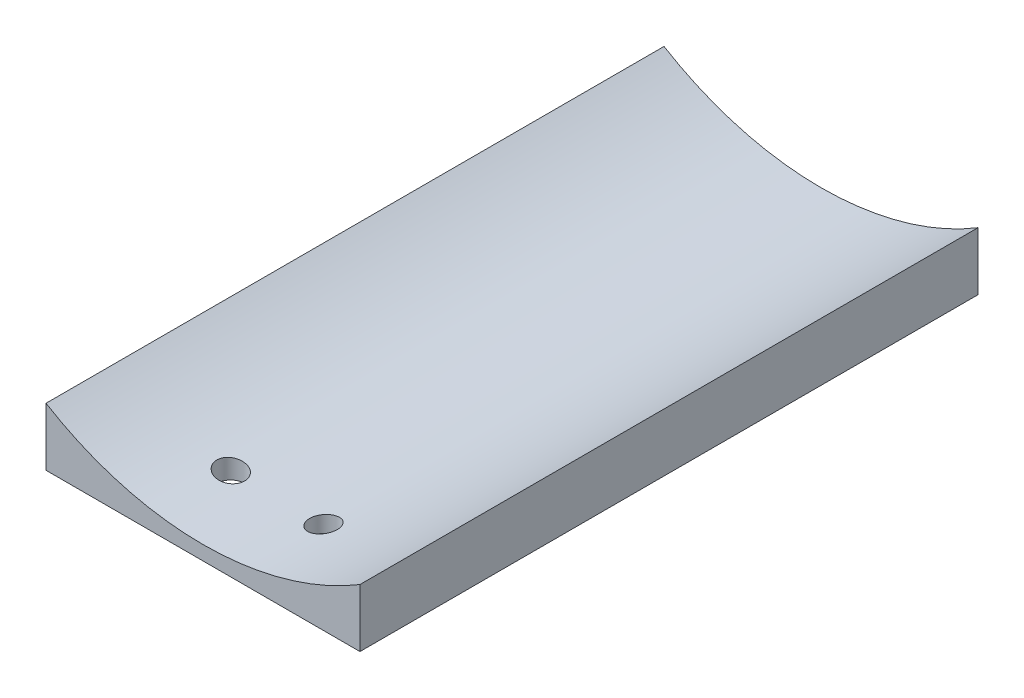
ISO-10303-21;
HEADER;
FILE_DESCRIPTION(('STEP AP214'),'2;1');
FILE_NAME('part.step','',(''),(''),'','','');
FILE_SCHEMA(('AUTOMOTIVE_DESIGN { 1 0 10303 214 1 1 1 1 }'));
ENDSEC;
DATA;
#1=APPLICATION_CONTEXT('core data for automotive mechanical design processes');
#2=APPLICATION_PROTOCOL_DEFINITION('international standard','automotive_design',2000,#1);
#3=PRODUCT_CONTEXT('',#1,'mechanical');
#4=PRODUCT('Part','Part','',(#3));
#5=PRODUCT_RELATED_PRODUCT_CATEGORY('part','',(#4));
#6=PRODUCT_DEFINITION_FORMATION('','',#4);
#7=PRODUCT_DEFINITION_CONTEXT('part definition',#1,'design');
#8=PRODUCT_DEFINITION('design','',#6,#7);
#9=PRODUCT_DEFINITION_SHAPE('','',#8);
#10=(LENGTH_UNIT() NAMED_UNIT(*) SI_UNIT(.MILLI.,.METRE.));
#11=(NAMED_UNIT(*) PLANE_ANGLE_UNIT() SI_UNIT($,.RADIAN.));
#12=(NAMED_UNIT(*) SI_UNIT($,.STERADIAN.) SOLID_ANGLE_UNIT());
#13=UNCERTAINTY_MEASURE_WITH_UNIT(LENGTH_MEASURE(1.E-05),#10,'distance_accuracy_value','');
#14=(GEOMETRIC_REPRESENTATION_CONTEXT(3) GLOBAL_UNCERTAINTY_ASSIGNED_CONTEXT((#13)) GLOBAL_UNIT_ASSIGNED_CONTEXT((#10,
#11,#12)) REPRESENTATION_CONTEXT('',''));
#15=CARTESIAN_POINT('',(0.,0.,0.));
#16=DIRECTION('',(0.,0.,1.));
#17=DIRECTION('',(1.,0.,0.));
#18=AXIS2_PLACEMENT_3D('',#15,#16,#17);
#19=CARTESIAN_POINT('',(0.,0.,-20.));
#20=DIRECTION('',(0.,0.,-1.));
#21=DIRECTION('',(-1.,0.,0.));
#22=AXIS2_PLACEMENT_3D('',#19,#20,#21);
#23=PLANE('',#22);
#24=DIRECTION('',(0.,-1.,0.));
#25=VECTOR('',#24,1.);
#26=CARTESIAN_POINT('',(25.4,30.,-20.));
#27=LINE('',#26,#25);
#28=CARTESIAN_POINT('',(25.4,22.0972554598151,-20.));
#29=VERTEX_POINT('',#28);
#30=CARTESIAN_POINT('',(25.4,12.7,-20.));
#31=VERTEX_POINT('',#30);
#32=EDGE_CURVE('E58',#29,#31,#27,.T.);
#33=ORIENTED_EDGE('',*,*,#32,.T.);
#34=DIRECTION('',(-1.,0.,0.));
#35=VECTOR('',#34,1.);
#36=CARTESIAN_POINT('',(63.51,12.7,-20.));
#37=LINE('',#36,#35);
#38=CARTESIAN_POINT('',(-25.4,12.7,-20.));
#39=VERTEX_POINT('',#38);
#40=EDGE_CURVE('E102',#31,#39,#37,.T.);
#41=ORIENTED_EDGE('',*,*,#40,.T.);
#42=DIRECTION('',(0.,1.,0.));
#43=VECTOR('',#42,1.);
#44=CARTESIAN_POINT('',(-25.4,30.,-20.));
#45=LINE('',#44,#43);
#46=CARTESIAN_POINT('',(-25.4,22.097255459815,-20.));
#47=VERTEX_POINT('',#46);
#48=EDGE_CURVE('E90',#39,#47,#45,.T.);
#49=ORIENTED_EDGE('',*,*,#48,.T.);
#50=CARTESIAN_POINT('',(0.,64.,-20.));
#51=DIRECTION('',(0.,0.,1.));
#52=DIRECTION('',(1.,0.,0.));
#53=AXIS2_PLACEMENT_3D('',#50,#51,#52);
#54=CIRCLE('',#53,49.);
#55=EDGE_CURVE('E235',#47,#29,#54,.T.);
#56=ORIENTED_EDGE('',*,*,#55,.T.);
#57=EDGE_LOOP('',(#33,#41,#49,#56));
#58=FACE_BOUND('',#57,.T.);
#59=ADVANCED_FACE('F47',(#58),#23,.T.);
#60=CARTESIAN_POINT('',(25.4,30.,80.));
#61=DIRECTION('',(-1.,0.,0.));
#62=DIRECTION('',(0.,0.,1.));
#63=AXIS2_PLACEMENT_3D('',#60,#61,#62);
#64=PLANE('',#63);
#65=DIRECTION('',(0.,0.,-1.));
#66=VECTOR('',#65,1.);
#67=CARTESIAN_POINT('',(25.4,12.7,80.));
#68=LINE('',#67,#66);
#69=CARTESIAN_POINT('',(25.4,12.7,80.));
#70=VERTEX_POINT('',#69);
#71=EDGE_CURVE('E11',#70,#31,#68,.T.);
#72=ORIENTED_EDGE('',*,*,#71,.T.);
#73=ORIENTED_EDGE('',*,*,#32,.F.);
#74=DIRECTION('',(0.,0.,1.));
#75=VECTOR('',#74,1.);
#76=CARTESIAN_POINT('',(25.4,22.0972554598151,-20.));
#77=LINE('',#76,#75);
#78=CARTESIAN_POINT('',(25.4,22.0972554598151,80.));
#79=VERTEX_POINT('',#78);
#80=EDGE_CURVE('E238',#29,#79,#77,.T.);
#81=ORIENTED_EDGE('',*,*,#80,.T.);
#82=DIRECTION('',(0.,-1.,0.));
#83=VECTOR('',#82,1.);
#84=CARTESIAN_POINT('',(25.4,30.,80.));
#85=LINE('',#84,#83);
#86=EDGE_CURVE('E248',#79,#70,#85,.T.);
#87=ORIENTED_EDGE('',*,*,#86,.T.);
#88=EDGE_LOOP('',(#72,#73,#81,#87));
#89=FACE_BOUND('',#88,.T.);
#90=ADVANCED_FACE('F150',(#89),#64,.F.);
#91=CARTESIAN_POINT('',(7.50000000000002,0.,68.));
#92=DIRECTION('',(0.,-1.,0.));
#93=DIRECTION('',(0.,0.,-1.));
#94=AXIS2_PLACEMENT_3D('',#91,#92,#93);
#95=CYLINDRICAL_SURFACE('',#94,2.25);
#96=CARTESIAN_POINT('',(7.50000000000002,15.577381318231,65.75));
#97=CARTESIAN_POINT('',(7.628012111726,15.597209390993,65.7500055593505));
#98=CARTESIAN_POINT('',(7.75603908473121,15.6175636610785,65.7609597123096));
#99=CARTESIAN_POINT('',(8.00842021394335,15.658696630682,65.8044487558249));
#100=CARTESIAN_POINT('',(8.13276950128072,15.6794758361999,65.8370110249154));
#101=CARTESIAN_POINT('',(8.37413092049167,15.7207196170612,65.922794270927));
#102=CARTESIAN_POINT('',(8.49114637916096,15.741184331838,65.9760058009177));
#103=CARTESIAN_POINT('',(8.71453836839212,15.7810233408164,66.1016282301116));
#104=CARTESIAN_POINT('',(8.82091771802788,15.8003979233565,66.1740340232468));
#105=CARTESIAN_POINT('',(9.01979673057494,15.837218814644,66.3359313789961));
#106=CARTESIAN_POINT('',(9.11232383039285,15.8546689166162,66.425388347351));
#107=CARTESIAN_POINT('',(9.28098907001027,15.8868974758926,66.6190359794301));
#108=CARTESIAN_POINT('',(9.35712764943423,15.9016760048603,66.723226247807));
#109=CARTESIAN_POINT('',(9.48972709811994,15.9276628427844,66.9418836795673));
#110=CARTESIAN_POINT('',(9.54644342071123,15.9389173186091,67.0561903752019));
#111=CARTESIAN_POINT('',(9.63982834212078,15.9575604989746,67.2930132324826));
#112=CARTESIAN_POINT('',(9.67649931209462,15.9649496607373,67.4155284212245));
#113=CARTESIAN_POINT('',(9.7281284215421,15.9753791836516,67.662918690262));
#114=CARTESIAN_POINT('',(9.74346580510113,15.9784954880935,67.7877114997753));
#115=CARTESIAN_POINT('',(9.75316313629945,15.9804640137949,68.0381386688777));
#116=CARTESIAN_POINT('',(9.74752463753941,15.9793165508549,68.163772965453));
#117=CARTESIAN_POINT('',(9.71561622413508,15.9728508448629,68.4110097229757));
#118=CARTESIAN_POINT('',(9.68955098112392,15.9675739783086,68.5326397758451));
#119=CARTESIAN_POINT('',(9.61786017104885,15.9531677261214,68.7697461754686));
#120=CARTESIAN_POINT('',(9.57223427998517,15.944038276675,68.8852224202563));
#121=CARTESIAN_POINT('',(9.46251582810181,15.9223136689365,69.1074622062525));
#122=CARTESIAN_POINT('',(9.39832470210526,15.9097000291337,69.2141752342499));
#123=CARTESIAN_POINT('',(9.25347524205779,15.8816186637555,69.4153412932485));
#124=CARTESIAN_POINT('',(9.17281556657491,15.8661507056938,69.5097933245148));
#125=CARTESIAN_POINT('',(8.99586260050361,15.8327634478072,69.685434807945));
#126=CARTESIAN_POINT('',(8.89933278514944,15.8148078327427,69.7663790437941));
#127=CARTESIAN_POINT('',(8.69434177346173,15.7773988332725,69.910964057507));
#128=CARTESIAN_POINT('',(8.58587947258229,15.7579453102612,69.9746032316094));
#129=CARTESIAN_POINT('',(8.35814909327495,15.7179649562042,70.0838148152157));
#130=CARTESIAN_POINT('',(8.23873354146886,15.6974257893936,70.129075394263));
#131=CARTESIAN_POINT('',(7.99397826064038,15.656316820316,70.1987903168134));
#132=CARTESIAN_POINT('',(7.86863824902037,15.635747016633,70.2232436667491));
#133=CARTESIAN_POINT('',(7.61466705728205,15.5951088441296,70.2507273538284));
#134=CARTESIAN_POINT('',(7.48601938102004,15.5750447930966,70.2536120862373));
#135=CARTESIAN_POINT('',(7.22992336115789,15.5361476530431,70.2374135732674));
#136=CARTESIAN_POINT('',(7.10247500072671,15.5173145467255,70.2183306366448));
#137=CARTESIAN_POINT('',(6.85298091147682,15.4814212838101,70.1587606268426));
#138=CARTESIAN_POINT('',(6.73091520091365,15.464354184596,70.118361499629));
#139=CARTESIAN_POINT('',(6.49521299776712,15.4322497219861,70.0172616496348));
#140=CARTESIAN_POINT('',(6.3815760926147,15.4172122592149,69.9565619213205));
#141=CARTESIAN_POINT('',(6.16714661576844,15.389528925854,69.8171949756079));
#142=CARTESIAN_POINT('',(6.06624209776508,15.3768616566205,69.7387042512458));
#143=CARTESIAN_POINT('',(5.87902434815,15.3538697661579,69.5656266816005));
#144=CARTESIAN_POINT('',(5.79271041414665,15.3435450321507,69.4710406115885));
#145=CARTESIAN_POINT('',(5.63795713164395,15.3253713430171,69.2693730619903));
#146=CARTESIAN_POINT('',(5.56936532475836,15.31750114161,69.1624104672917));
#147=CARTESIAN_POINT('',(5.45109244562694,15.3041156794153,68.9383616866586));
#148=CARTESIAN_POINT('',(5.40141074136657,15.2986003399225,68.8212758392246));
#149=CARTESIAN_POINT('',(5.32265902359327,15.2899304811374,68.5810155431723));
#150=CARTESIAN_POINT('',(5.29347476161626,15.2867628705351,68.4578790031678));
#151=CARTESIAN_POINT('',(5.25612713728423,15.2827188110226,68.2084217860801));
#152=CARTESIAN_POINT('',(5.24796345558871,15.281842327306,68.0821011573983));
#153=CARTESIAN_POINT('',(5.25289138597353,15.2823734473757,67.8301894624403));
#154=CARTESIAN_POINT('',(5.26593125585982,15.2837754909565,67.7045973684802));
#155=CARTESIAN_POINT('',(5.31278508766321,15.2888630516745,67.4573985569649));
#156=CARTESIAN_POINT('',(5.34659897571597,15.2925485606925,67.3357918252409));
#157=CARTESIAN_POINT('',(5.43401077895919,15.3022233798455,67.1000004015597));
#158=CARTESIAN_POINT('',(5.48760993009529,15.3082128339045,66.9858161737956));
#159=CARTESIAN_POINT('',(5.61301877253993,15.3225104796827,66.7680975666634));
#160=CARTESIAN_POINT('',(5.68482783751499,15.3308185916522,66.6645628211764));
#161=CARTESIAN_POINT('',(5.84475564904883,15.3497655419543,66.4707889771997));
#162=CARTESIAN_POINT('',(5.93291351702032,15.3604099823963,66.3805827232072));
#163=CARTESIAN_POINT('',(6.12288475566154,15.3839591883326,66.216231094813));
#164=CARTESIAN_POINT('',(6.22470173961046,15.3968645521918,66.142089983781));
#165=CARTESIAN_POINT('',(6.43968893859219,15.4248806317548,66.0114922317072));
#166=CARTESIAN_POINT('',(6.55292516873467,15.4400044311161,65.9551472348386));
#167=CARTESIAN_POINT('',(6.78689554019515,15.4721529541833,65.862293169079));
#168=CARTESIAN_POINT('',(6.90762110202076,15.4891755199517,65.8257618534679));
#169=CARTESIAN_POINT('',(7.10756543193489,15.5181617757285,65.7830776954983));
#170=CARTESIAN_POINT('',(7.18557568595643,15.529660763128,65.7706832778541));
#171=CARTESIAN_POINT('',(7.34238874823167,15.5531671289364,65.7541427116057));
#172=CARTESIAN_POINT('',(7.42119155787652,15.5651745082378,65.749996577482));
#173=CARTESIAN_POINT('',(7.50000000000002,15.577381318231,65.75));
#174=B_SPLINE_CURVE_WITH_KNOTS('',3,(#96,#97,#98,#99,#100,#101,#102,#103,#104,#105,#106,#107,
#108,#109,#110,#111,#112,#113,#114,#115,#116,#117,#118,#119,#120,#121,#122,#123,#124,#125,#126,
#127,#128,#129,#130,#131,#132,#133,#134,#135,#136,#137,#138,#139,#140,#141,#142,#143,#144,#145,
#146,#147,#148,#149,#150,#151,#152,#153,#154,#155,#156,#157,#158,#159,#160,#161,#162,#163,#164,
#165,#166,#167,#168,#169,#170,#171,#172,#173),.UNSPECIFIED.,.T.,.F.,(4,2,2,2,2,2,2,2,2,2,2,2,2,
2,2,2,2,2,2,2,2,2,2,2,2,2,2,2,2,2,2,2,2,2,2,2,2,2,4),(0.,0.388324372965482,0.777141713668451,
1.16578138175374,1.55431776727635,1.94207410390068,2.32982003760791,2.71225034395115,
3.09463540299366,3.47013200805642,3.84560080212388,4.21735484470044,4.58911504519548,
4.9628863830861,5.33668817836394,5.7166729715635,6.09669296818747,6.48291547687903,
6.869156427071,7.25800246607199,7.64684303989891,8.03409174397395,8.42132148066329,
8.80486597891188,9.18839200804262,9.56849969033591,9.9485946675327,10.3265538913895,
10.7045073733304,11.0815399335824,11.4585711532609,11.8356259293092,12.2126677382448,
12.5906237015288,12.9686798443019,13.3490626684547,13.729017511505,13.9680822744682,
14.2071474571245),.UNSPECIFIED.);
#175=CARTESIAN_POINT('',(7.50000000000002,15.577381318231,65.75));
#176=VERTEX_POINT('',#175);
#177=EDGE_CURVE('E131',#176,#176,#174,.T.);
#178=ORIENTED_EDGE('',*,*,#177,.F.);
#179=EDGE_LOOP('',(#178));
#180=FACE_BOUND('',#179,.T.);
#181=CARTESIAN_POINT('',(7.50000000000002,12.7000000000001,68.));
#182=DIRECTION('',(0.,-1.,0.));
#183=DIRECTION('',(0.,0.,-1.));
#184=AXIS2_PLACEMENT_3D('',#181,#182,#183);
#185=CIRCLE('',#184,2.25);
#186=CARTESIAN_POINT('',(7.50000000000002,12.7000000000001,65.75));
#187=VERTEX_POINT('',#186);
#188=EDGE_CURVE('E113',#187,#187,#185,.F.);
#189=ORIENTED_EDGE('',*,*,#188,.F.);
#190=EDGE_LOOP('',(#189));
#191=FACE_BOUND('',#190,.T.);
#192=ADVANCED_FACE('F49',(#180,#191),#95,.F.);
#193=CARTESIAN_POINT('',(-7.49999999999998,0.,68.));
#194=DIRECTION('',(0.,-1.,0.));
#195=DIRECTION('',(0.,0.,-1.));
#196=AXIS2_PLACEMENT_3D('',#193,#194,#195);
#197=CYLINDRICAL_SURFACE('',#196,2.25);
#198=CARTESIAN_POINT('',(-7.49999999999998,15.577381318231,65.75));
#199=CARTESIAN_POINT('',(-7.37313435960164,15.5577322739303,65.7500053346237));
#200=CARTESIAN_POINT('',(-7.24610419929036,15.5385722520921,65.7607633692795));
#201=CARTESIAN_POINT('',(-6.99536853130824,15.5017430611282,65.8036265899334));
#202=CARTESIAN_POINT('',(-6.87166683881492,15.4840755569758,65.8357552705344));
#203=CARTESIAN_POINT('',(-6.63124404765176,15.4506299367383,65.9205760115993));
#204=CARTESIAN_POINT('',(-6.51452257340452,15.4348517189526,65.9732669645402));
#205=CARTESIAN_POINT('',(-6.29151947463807,15.4054586610416,66.0977957102318));
#206=CARTESIAN_POINT('',(-6.18523518561701,15.3918432682191,66.16962859877));
#207=CARTESIAN_POINT('',(-5.98695103065325,15.3670240617637,66.3298757156647));
#208=CARTESIAN_POINT('',(-5.89485441732509,15.3558036931813,66.4181676499408));
#209=CARTESIAN_POINT('',(-5.72677627445682,15.3357295627254,66.6091869259792));
#210=CARTESIAN_POINT('',(-5.65079467046255,15.3268757899178,66.711914201044));
#211=CARTESIAN_POINT('',(-5.51776364115328,15.3116158752029,66.9279892718192));
#212=CARTESIAN_POINT('',(-5.46056703466236,15.3051906425411,67.0412451225983));
#213=CARTESIAN_POINT('',(-5.36596825740869,15.2946752015496,67.2758430164461));
#214=CARTESIAN_POINT('',(-5.328565494082,15.2905849233187,67.397184817325));
#215=CARTESIAN_POINT('',(-5.2747873641832,15.28473181772,67.6439125608657));
#216=CARTESIAN_POINT('',(-5.25831665169028,15.2829584357985,67.7692774796483));
#217=CARTESIAN_POINT('',(-5.24657274006595,15.2816922350544,68.0210069518504));
#218=CARTESIAN_POINT('',(-5.25129923262448,15.2821993830618,68.1473714907038));
#219=CARTESIAN_POINT('',(-5.2817849945267,15.2854952111792,68.3972967746039));
#220=CARTESIAN_POINT('',(-5.30751001252266,15.2882801758863,68.5208617490236));
#221=CARTESIAN_POINT('',(-5.3791934334561,15.296144224106,68.7618981026513));
#222=CARTESIAN_POINT('',(-5.42515179492794,15.301223302917,68.8793694943467));
#223=CARTESIAN_POINT('',(-5.53599662385857,15.3136996815585,69.1049888185267));
#224=CARTESIAN_POINT('',(-5.60089732898928,15.3210987254609,69.2131296583649));
#225=CARTESIAN_POINT('',(-5.74771375678324,15.338215914097,69.4169576019876));
#226=CARTESIAN_POINT('',(-5.82962962700719,15.3479340789429,69.5126445977569));
#227=CARTESIAN_POINT('',(-6.0083986433174,15.3696878321604,69.6892196969671));
#228=CARTESIAN_POINT('',(-6.10530171979334,15.3817312016142,69.7700562806889));
#229=CARTESIAN_POINT('',(-6.31103006432998,15.4080085115523,69.9143240675333));
#230=CARTESIAN_POINT('',(-6.41985567428387,15.4222425148605,69.9777547713382));
#231=CARTESIAN_POINT('',(-6.64708081693583,15.4528113018155,70.0858970568208));
#232=CARTESIAN_POINT('',(-6.76553993678963,15.4691595987178,70.1304795838264));
#233=CARTESIAN_POINT('',(-7.00801273253361,15.5035800727211,70.1991655454362));
#234=CARTESIAN_POINT('',(-7.13202669269249,15.5216523380995,70.2232679307067));
#235=CARTESIAN_POINT('',(-7.38333389965578,15.559287058732,70.2505588503413));
#236=CARTESIAN_POINT('',(-7.51064712615601,15.5788620630986,70.253546092945));
#237=CARTESIAN_POINT('',(-7.76383817236746,15.6188130739833,70.2380747527191));
#238=CARTESIAN_POINT('',(-7.88971590673934,15.6391891278063,70.2196149015121));
#239=CARTESIAN_POINT('',(-8.13761451200037,15.6802819074697,70.1615485721777));
#240=CARTESIAN_POINT('',(-8.25959290704296,15.7010000560815,70.1217616090603));
#241=CARTESIAN_POINT('',(-8.49511737876312,15.7418682381655,70.0220279383144));
#242=CARTESIAN_POINT('',(-8.60866321473998,15.7620182554106,69.9620806554955));
#243=CARTESIAN_POINT('',(-8.82423281761596,15.8009860635328,69.8235523062742));
#244=CARTESIAN_POINT('',(-8.92624141758423,15.8198020888897,69.7449471229735));
#245=CARTESIAN_POINT('',(-9.11557602268489,15.8552643608609,69.5712776372471));
#246=CARTESIAN_POINT('',(-9.2029026849255,15.8719107045744,69.4762140718234));
#247=CARTESIAN_POINT('',(-9.35941230572826,15.9021028757173,69.2733156432963));
#248=CARTESIAN_POINT('',(-9.42877237347686,15.915678787002,69.1656219535928));
#249=CARTESIAN_POINT('',(-9.54834974166715,15.9392805907822,68.9397282981042));
#250=CARTESIAN_POINT('',(-9.59856916978705,15.949306877846,68.8215295018716));
#251=CARTESIAN_POINT('',(-9.67752957291061,15.9651478128342,68.5802496308665));
#252=CARTESIAN_POINT('',(-9.70663892471253,15.9710346372216,68.4572938224818));
#253=CARTESIAN_POINT('',(-9.74389152732727,15.9785782465793,68.208122360189));
#254=CARTESIAN_POINT('',(-9.75203673455085,15.9802354262675,68.0819070115773));
#255=CARTESIAN_POINT('',(-9.74713342944525,15.9792399863327,67.8316592026487));
#256=CARTESIAN_POINT('',(-9.73437624847541,15.976646609559,67.7076206803546));
#257=CARTESIAN_POINT('',(-9.68862620037449,15.9673958661918,67.4634949263337));
#258=CARTESIAN_POINT('',(-9.65563355889518,15.9607385449164,67.3434076505612));
#259=CARTESIAN_POINT('',(-9.57042973265447,15.9436918886317,67.1105040407273));
#260=CARTESIAN_POINT('',(-9.51821239166048,15.9333013581805,66.9976900493681));
#261=CARTESIAN_POINT('',(-9.39614017703636,15.909289842858,66.7824351865797));
#262=CARTESIAN_POINT('',(-9.32628482964804,15.8956687712148,66.6799945938842));
#263=CARTESIAN_POINT('',(-9.16988064327067,15.8656079230248,66.4868393461204));
#264=CARTESIAN_POINT('',(-9.08311366768787,15.8491316653961,66.3963070729679));
#265=CARTESIAN_POINT('',(-8.89597922701539,15.8142075108408,66.2310077168569));
#266=CARTESIAN_POINT('',(-8.79560723036384,15.7957589574162,66.1562459080262));
#267=CARTESIAN_POINT('',(-8.58213485149928,15.7572914609062,66.0232373873532));
#268=CARTESIAN_POINT('',(-8.46883634401565,15.7372500757788,65.9653154123814));
#269=CARTESIAN_POINT('',(-8.23427662481044,15.6966791888594,65.8694227392458));
#270=CARTESIAN_POINT('',(-8.11302417185289,15.6761502393509,65.8314304963052));
#271=CARTESIAN_POINT('',(-7.90924636873642,15.6424723938939,65.7860004679588));
#272=CARTESIAN_POINT('',(-7.82802817562004,15.62925652028,65.7725219686));
#273=CARTESIAN_POINT('',(-7.66456308175459,15.6030855762024,65.7545199661856));
#274=CARTESIAN_POINT('',(-7.5823161723355,15.5901305079392,65.7499965386546));
#275=CARTESIAN_POINT('',(-7.49999999999998,15.577381318231,65.75));
#276=B_SPLINE_CURVE_WITH_KNOTS('',3,(#198,#199,#200,#201,#202,#203,#204,#205,#206,#207,#208,
#209,#210,#211,#212,#213,#214,#215,#216,#217,#218,#219,#220,#221,#222,#223,#224,#225,#226,#227,
#228,#229,#230,#231,#232,#233,#234,#235,#236,#237,#238,#239,#240,#241,#242,#243,#244,#245,#246,
#247,#248,#249,#250,#251,#252,#253,#254,#255,#256,#257,#258,#259,#260,#261,#262,#263,#264,#265,
#266,#267,#268,#269,#270,#271,#272,#273,#274,#275),.UNSPECIFIED.,.T.,.F.,(4,2,2,2,2,2,2,2,2,2,2,
2,2,2,2,2,2,2,2,2,2,2,2,2,2,2,2,2,2,2,2,2,2,2,2,2,2,2,4),(0.,0.384834670716785,
0.770093124360788,1.15533083011541,1.5404699317265,1.9228538621893,2.30523602593339,
2.68454647039847,3.06384555888759,3.44141066614733,3.81897028179907,4.19591527595674,
4.57285949761775,4.95008777548194,5.32731932492143,5.70583583836864,6.08436320908104,
6.46544197579724,6.84654026653273,7.2312667465696,7.61601598042156,8.00407385983673,
8.39214281180245,8.78071613349627,9.16927205947984,9.55383789762288,9.9383609748563,
10.31600102464,10.6936058311138,11.0659923223443,11.4383746610552,11.8108763498276,
12.1833880450884,12.5610673970168,12.9388728569733,13.3235425515947,13.7077955426123,
13.9574915975469,14.2071897583408),.UNSPECIFIED.);
#277=CARTESIAN_POINT('',(-7.49999999999998,15.577381318231,65.75));
#278=VERTEX_POINT('',#277);
#279=EDGE_CURVE('E99',#278,#278,#276,.T.);
#280=ORIENTED_EDGE('',*,*,#279,.F.);
#281=EDGE_LOOP('',(#280));
#282=FACE_BOUND('',#281,.T.);
#283=CARTESIAN_POINT('',(-7.49999999999998,12.7000000000001,68.));
#284=DIRECTION('',(0.,-1.,0.));
#285=DIRECTION('',(0.,0.,-1.));
#286=AXIS2_PLACEMENT_3D('',#283,#284,#285);
#287=CIRCLE('',#286,2.25);
#288=CARTESIAN_POINT('',(-7.49999999999998,12.7000000000001,65.75));
#289=VERTEX_POINT('',#288);
#290=EDGE_CURVE('E110',#289,#289,#287,.F.);
#291=ORIENTED_EDGE('',*,*,#290,.F.);
#292=EDGE_LOOP('',(#291));
#293=FACE_BOUND('',#292,.T.);
#294=ADVANCED_FACE('F139',(#282,#293),#197,.F.);
#295=CARTESIAN_POINT('',(0.,64.,-20.));
#296=DIRECTION('',(0.,0.,1.));
#297=DIRECTION('',(1.,0.,0.));
#298=AXIS2_PLACEMENT_3D('',#295,#296,#297);
#299=CYLINDRICAL_SURFACE('',#298,49.);
#300=ORIENTED_EDGE('',*,*,#279,.T.);
#301=EDGE_LOOP('',(#300));
#302=FACE_BOUND('',#301,.T.);
#303=ORIENTED_EDGE('',*,*,#177,.T.);
#304=EDGE_LOOP('',(#303));
#305=FACE_BOUND('',#304,.T.);
#306=ORIENTED_EDGE('',*,*,#55,.F.);
#307=DIRECTION('',(0.,0.,1.));
#308=VECTOR('',#307,1.);
#309=CARTESIAN_POINT('',(-25.4,22.097255459815,-20.));
#310=LINE('',#309,#308);
#311=CARTESIAN_POINT('',(-25.4,22.097255459815,80.));
#312=VERTEX_POINT('',#311);
#313=EDGE_CURVE('E95',#312,#47,#310,.F.);
#314=ORIENTED_EDGE('',*,*,#313,.F.);
#315=CARTESIAN_POINT('',(0.,64.,80.));
#316=DIRECTION('',(0.,0.,1.));
#317=DIRECTION('',(1.,0.,0.));
#318=AXIS2_PLACEMENT_3D('',#315,#316,#317);
#319=CIRCLE('',#318,49.);
#320=EDGE_CURVE('E240',#312,#79,#319,.T.);
#321=ORIENTED_EDGE('',*,*,#320,.T.);
#322=ORIENTED_EDGE('',*,*,#80,.F.);
#323=EDGE_LOOP('',(#306,#314,#321,#322));
#324=FACE_BOUND('',#323,.T.);
#325=ADVANCED_FACE('F143',(#302,#305,#324),#299,.F.);
#326=CARTESIAN_POINT('',(-25.4,30.,80.));
#327=DIRECTION('',(1.,0.,0.));
#328=DIRECTION('',(0.,0.,-1.));
#329=AXIS2_PLACEMENT_3D('',#326,#327,#328);
#330=PLANE('',#329);
#331=ORIENTED_EDGE('',*,*,#48,.F.);
#332=DIRECTION('',(0.,0.,-1.));
#333=VECTOR('',#332,1.);
#334=CARTESIAN_POINT('',(-25.3999999999999,12.7000000000001,80.));
#335=LINE('',#334,#333);
#336=CARTESIAN_POINT('',(-25.3999999999999,12.7000000000001,80.));
#337=VERTEX_POINT('',#336);
#338=EDGE_CURVE('E52',#337,#39,#335,.T.);
#339=ORIENTED_EDGE('',*,*,#338,.F.);
#340=DIRECTION('',(0.,-1.,0.));
#341=VECTOR('',#340,1.);
#342=CARTESIAN_POINT('',(-25.4,30.,80.));
#343=LINE('',#342,#341);
#344=EDGE_CURVE('E104',#312,#337,#343,.T.);
#345=ORIENTED_EDGE('',*,*,#344,.F.);
#346=ORIENTED_EDGE('',*,*,#313,.T.);
#347=EDGE_LOOP('',(#331,#339,#345,#346));
#348=FACE_BOUND('',#347,.T.);
#349=ADVANCED_FACE('F92',(#348),#330,.F.);
#350=CARTESIAN_POINT('',(-25.4,30.,80.));
#351=DIRECTION('',(0.,0.,-1.));
#352=DIRECTION('',(-1.,0.,0.));
#353=AXIS2_PLACEMENT_3D('',#350,#351,#352);
#354=PLANE('',#353);
#355=DIRECTION('',(-1.,0.,0.));
#356=VECTOR('',#355,1.);
#357=CARTESIAN_POINT('',(63.51,12.7000000000001,80.));
#358=LINE('',#357,#356);
#359=EDGE_CURVE('E105',#70,#337,#358,.T.);
#360=ORIENTED_EDGE('',*,*,#359,.F.);
#361=ORIENTED_EDGE('',*,*,#86,.F.);
#362=ORIENTED_EDGE('',*,*,#320,.F.);
#363=ORIENTED_EDGE('',*,*,#344,.T.);
#364=EDGE_LOOP('',(#360,#361,#362,#363));
#365=FACE_BOUND('',#364,.T.);
#366=ADVANCED_FACE('F145',(#365),#354,.F.);
#367=CARTESIAN_POINT('',(63.51,12.7000000000001,80.));
#368=DIRECTION('',(0.,-1.,0.));
#369=DIRECTION('',(0.,0.,-1.));
#370=AXIS2_PLACEMENT_3D('',#367,#368,#369);
#371=PLANE('',#370);
#372=ORIENTED_EDGE('',*,*,#359,.T.);
#373=ORIENTED_EDGE('',*,*,#338,.T.);
#374=ORIENTED_EDGE('',*,*,#40,.F.);
#375=ORIENTED_EDGE('',*,*,#71,.F.);
#376=EDGE_LOOP('',(#372,#373,#374,#375));
#377=FACE_BOUND('',#376,.T.);
#378=ORIENTED_EDGE('',*,*,#188,.T.);
#379=EDGE_LOOP('',(#378));
#380=FACE_BOUND('',#379,.T.);
#381=ORIENTED_EDGE('',*,*,#290,.T.);
#382=EDGE_LOOP('',(#381));
#383=FACE_BOUND('',#382,.T.);
#384=ADVANCED_FACE('F107',(#377,#380,#383),#371,.T.);
#385=CLOSED_SHELL('',(#59,#90,#192,#294,#325,#349,#366,#384));
#386=MANIFOLD_SOLID_BREP('B2',#385);
#387=ADVANCED_BREP_SHAPE_REPRESENTATION('',(#18,#386),#14);
#388=SHAPE_DEFINITION_REPRESENTATION(#9,#387);
ENDSEC;
END-ISO-10303-21;
